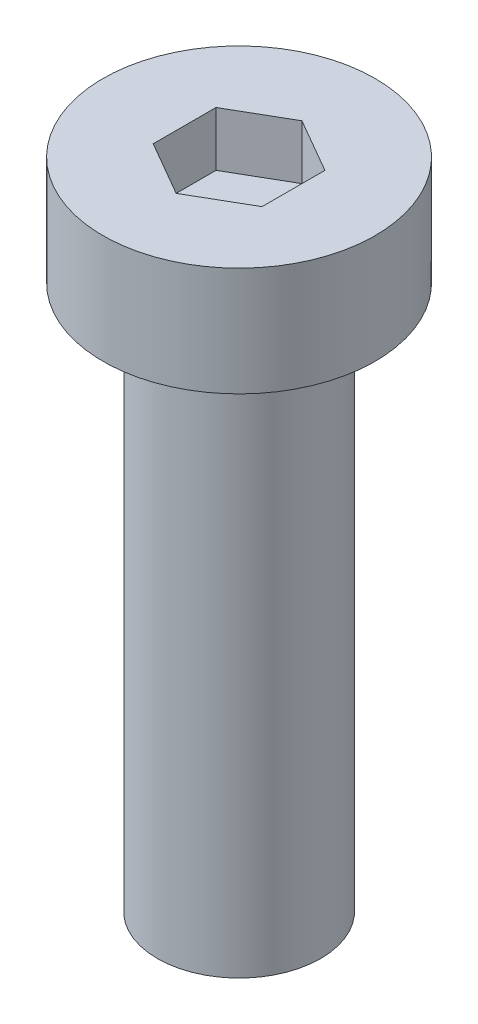
ISO-10303-21;
HEADER;
FILE_DESCRIPTION(('STEP AP214'),'2;1');
FILE_NAME('part.step','',(''),(''),'','','');
FILE_SCHEMA(('AUTOMOTIVE_DESIGN { 1 0 10303 214 1 1 1 1 }'));
ENDSEC;
DATA;
#1=APPLICATION_CONTEXT('core data for automotive mechanical design processes');
#2=APPLICATION_PROTOCOL_DEFINITION('international standard','automotive_design',2000,#1);
#3=PRODUCT_CONTEXT('',#1,'mechanical');
#4=PRODUCT('Part','Part','',(#3));
#5=PRODUCT_RELATED_PRODUCT_CATEGORY('part','',(#4));
#6=PRODUCT_DEFINITION_FORMATION('','',#4);
#7=PRODUCT_DEFINITION_CONTEXT('part definition',#1,'design');
#8=PRODUCT_DEFINITION('design','',#6,#7);
#9=PRODUCT_DEFINITION_SHAPE('','',#8);
#10=(LENGTH_UNIT() NAMED_UNIT(*) SI_UNIT(.MILLI.,.METRE.));
#11=(NAMED_UNIT(*) PLANE_ANGLE_UNIT() SI_UNIT($,.RADIAN.));
#12=(NAMED_UNIT(*) SI_UNIT($,.STERADIAN.) SOLID_ANGLE_UNIT());
#13=UNCERTAINTY_MEASURE_WITH_UNIT(LENGTH_MEASURE(1.E-05),#10,'distance_accuracy_value','');
#14=(GEOMETRIC_REPRESENTATION_CONTEXT(3) GLOBAL_UNCERTAINTY_ASSIGNED_CONTEXT((#13)) GLOBAL_UNIT_ASSIGNED_CONTEXT((#10,
#11,#12)) REPRESENTATION_CONTEXT('',''));
#15=CARTESIAN_POINT('',(0.,0.,0.));
#16=DIRECTION('',(0.,0.,1.));
#17=DIRECTION('',(1.,0.,0.));
#18=AXIS2_PLACEMENT_3D('',#15,#16,#17);
#19=CARTESIAN_POINT('',(3.,0.,0.));
#20=DIRECTION('',(0.,-1.,0.));
#21=DIRECTION('',(0.,0.,-1.));
#22=AXIS2_PLACEMENT_3D('',#19,#20,#21);
#23=PLANE('',#22);
#24=CARTESIAN_POINT('',(0.,0.,0.));
#25=DIRECTION('',(0.,-1.,0.));
#26=DIRECTION('',(0.,0.,-1.));
#27=AXIS2_PLACEMENT_3D('',#24,#25,#26);
#28=CIRCLE('',#27,3.);
#29=CARTESIAN_POINT('',(0.,0.,-3.));
#30=VERTEX_POINT('',#29);
#31=EDGE_CURVE('E134',#30,#30,#28,.T.);
#32=ORIENTED_EDGE('',*,*,#31,.T.);
#33=EDGE_LOOP('',(#32));
#34=FACE_BOUND('',#33,.T.);
#35=ADVANCED_FACE('F33',(#34),#23,.T.);
#36=CARTESIAN_POINT('',(0.,24.,0.));
#37=DIRECTION('',(0.,1.,0.));
#38=DIRECTION('',(0.,0.,1.));
#39=AXIS2_PLACEMENT_3D('',#36,#37,#38);
#40=PLANE('',#39);
#41=DIRECTION('',(0.866025403784439,0.,0.5));
#42=VECTOR('',#41,1.);
#43=CARTESIAN_POINT('',(-2.,24.,1.15470053837925));
#44=LINE('',#43,#42);
#45=CARTESIAN_POINT('',(-2.,24.,1.15470053837925));
#46=VERTEX_POINT('',#45);
#47=CARTESIAN_POINT('',(0.,24.,2.3094010767585));
#48=VERTEX_POINT('',#47);
#49=EDGE_CURVE('E47',#46,#48,#44,.T.);
#50=ORIENTED_EDGE('',*,*,#49,.F.);
#51=DIRECTION('',(0.,0.,1.));
#52=VECTOR('',#51,1.);
#53=CARTESIAN_POINT('',(-2.,24.,-1.15470053837925));
#54=LINE('',#53,#52);
#55=CARTESIAN_POINT('',(-2.,24.,-1.15470053837925));
#56=VERTEX_POINT('',#55);
#57=EDGE_CURVE('E130',#56,#46,#54,.T.);
#58=ORIENTED_EDGE('',*,*,#57,.F.);
#59=DIRECTION('',(-0.866025403784439,0.,0.5));
#60=VECTOR('',#59,1.);
#61=CARTESIAN_POINT('',(0.,24.,-2.3094010767585));
#62=LINE('',#61,#60);
#63=CARTESIAN_POINT('',(0.,24.,-2.3094010767585));
#64=VERTEX_POINT('',#63);
#65=EDGE_CURVE('E128',#64,#56,#62,.T.);
#66=ORIENTED_EDGE('',*,*,#65,.F.);
#67=DIRECTION('',(-0.866025403784439,0.,-0.5));
#68=VECTOR('',#67,1.);
#69=CARTESIAN_POINT('',(2.,24.,-1.15470053837925));
#70=LINE('',#69,#68);
#71=CARTESIAN_POINT('',(2.,24.,-1.15470053837925));
#72=VERTEX_POINT('',#71);
#73=EDGE_CURVE('E95',#72,#64,#70,.T.);
#74=ORIENTED_EDGE('',*,*,#73,.F.);
#75=DIRECTION('',(0.,0.,-1.));
#76=VECTOR('',#75,1.);
#77=CARTESIAN_POINT('',(2.,24.,1.15470053837925));
#78=LINE('',#77,#76);
#79=CARTESIAN_POINT('',(2.,24.,1.15470053837925));
#80=VERTEX_POINT('',#79);
#81=EDGE_CURVE('E124',#80,#72,#78,.T.);
#82=ORIENTED_EDGE('',*,*,#81,.F.);
#83=DIRECTION('',(0.866025403784438,0.,-0.5));
#84=VECTOR('',#83,1.);
#85=CARTESIAN_POINT('',(0.,24.,2.3094010767585));
#86=LINE('',#85,#84);
#87=EDGE_CURVE('E121',#48,#80,#86,.T.);
#88=ORIENTED_EDGE('',*,*,#87,.F.);
#89=EDGE_LOOP('',(#50,#58,#66,#74,#82,#88));
#90=FACE_BOUND('',#89,.T.);
#91=CARTESIAN_POINT('',(0.,24.,0.));
#92=DIRECTION('',(0.,-1.,0.));
#93=DIRECTION('',(0.,0.,-1.));
#94=AXIS2_PLACEMENT_3D('',#91,#92,#93);
#95=CIRCLE('',#94,5.);
#96=CARTESIAN_POINT('',(0.,24.,-5.));
#97=VERTEX_POINT('',#96);
#98=EDGE_CURVE('E11',#97,#97,#95,.T.);
#99=ORIENTED_EDGE('',*,*,#98,.F.);
#100=EDGE_LOOP('',(#99));
#101=FACE_BOUND('',#100,.T.);
#102=ADVANCED_FACE('F152',(#90,#101),#40,.T.);
#103=CARTESIAN_POINT('',(0.,0.,0.));
#104=DIRECTION('',(0.,-1.,0.));
#105=DIRECTION('',(0.,0.,-1.));
#106=AXIS2_PLACEMENT_3D('',#103,#104,#105);
#107=CYLINDRICAL_SURFACE('',#106,5.);
#108=ORIENTED_EDGE('',*,*,#98,.T.);
#109=EDGE_LOOP('',(#108));
#110=FACE_BOUND('',#109,.T.);
#111=CARTESIAN_POINT('',(0.,20.,0.));
#112=DIRECTION('',(0.,-1.,0.));
#113=DIRECTION('',(0.,0.,-1.));
#114=AXIS2_PLACEMENT_3D('',#111,#112,#113);
#115=CIRCLE('',#114,5.);
#116=CARTESIAN_POINT('',(0.,20.,-5.));
#117=VERTEX_POINT('',#116);
#118=EDGE_CURVE('E40',#117,#117,#115,.T.);
#119=ORIENTED_EDGE('',*,*,#118,.F.);
#120=EDGE_LOOP('',(#119));
#121=FACE_BOUND('',#120,.T.);
#122=ADVANCED_FACE('F150',(#110,#121),#107,.T.);
#123=CARTESIAN_POINT('',(5.,20.,0.));
#124=DIRECTION('',(0.,-1.,0.));
#125=DIRECTION('',(0.,0.,-1.));
#126=AXIS2_PLACEMENT_3D('',#123,#124,#125);
#127=PLANE('',#126);
#128=ORIENTED_EDGE('',*,*,#118,.T.);
#129=EDGE_LOOP('',(#128));
#130=FACE_BOUND('',#129,.T.);
#131=CARTESIAN_POINT('',(0.,20.,0.));
#132=DIRECTION('',(0.,-1.,0.));
#133=DIRECTION('',(0.,0.,-1.));
#134=AXIS2_PLACEMENT_3D('',#131,#132,#133);
#135=CIRCLE('',#134,3.);
#136=CARTESIAN_POINT('',(0.,20.,-3.));
#137=VERTEX_POINT('',#136);
#138=EDGE_CURVE('E142',#137,#137,#135,.T.);
#139=ORIENTED_EDGE('',*,*,#138,.F.);
#140=EDGE_LOOP('',(#139));
#141=FACE_BOUND('',#140,.T.);
#142=ADVANCED_FACE('F147',(#130,#141),#127,.T.);
#143=CARTESIAN_POINT('',(0.,0.,0.));
#144=DIRECTION('',(0.,-1.,0.));
#145=DIRECTION('',(0.,0.,-1.));
#146=AXIS2_PLACEMENT_3D('',#143,#144,#145);
#147=CYLINDRICAL_SURFACE('',#146,3.);
#148=ORIENTED_EDGE('',*,*,#138,.T.);
#149=EDGE_LOOP('',(#148));
#150=FACE_BOUND('',#149,.T.);
#151=ORIENTED_EDGE('',*,*,#31,.F.);
#152=EDGE_LOOP('',(#151));
#153=FACE_BOUND('',#152,.T.);
#154=ADVANCED_FACE('F159',(#150,#153),#147,.T.);
#155=CARTESIAN_POINT('',(-2.,22.,1.15470053837925));
#156=DIRECTION('',(-0.5,0.,0.866025403784438));
#157=DIRECTION('',(0.866025403784439,0.,0.5));
#158=AXIS2_PLACEMENT_3D('',#155,#156,#157);
#159=PLANE('',#158);
#160=ORIENTED_EDGE('',*,*,#49,.T.);
#161=DIRECTION('',(0.,1.,0.));
#162=VECTOR('',#161,1.);
#163=CARTESIAN_POINT('',(0.,22.,2.3094010767585));
#164=LINE('',#163,#162);
#165=CARTESIAN_POINT('',(0.,22.,2.3094010767585));
#166=VERTEX_POINT('',#165);
#167=EDGE_CURVE('E77',#166,#48,#164,.T.);
#168=ORIENTED_EDGE('',*,*,#167,.F.);
#169=DIRECTION('',(0.866025403784439,0.,0.5));
#170=VECTOR('',#169,1.);
#171=CARTESIAN_POINT('',(-2.,22.,1.15470053837925));
#172=LINE('',#171,#170);
#173=CARTESIAN_POINT('',(-2.,22.,1.15470053837925));
#174=VERTEX_POINT('',#173);
#175=EDGE_CURVE('E132',#174,#166,#172,.T.);
#176=ORIENTED_EDGE('',*,*,#175,.F.);
#177=DIRECTION('',(0.,1.,0.));
#178=VECTOR('',#177,1.);
#179=CARTESIAN_POINT('',(-2.,22.,1.15470053837925));
#180=LINE('',#179,#178);
#181=EDGE_CURVE('E55',#174,#46,#180,.T.);
#182=ORIENTED_EDGE('',*,*,#181,.T.);
#183=EDGE_LOOP('',(#160,#168,#176,#182));
#184=FACE_BOUND('',#183,.T.);
#185=ADVANCED_FACE('F169',(#184),#159,.F.);
#186=CARTESIAN_POINT('',(-2.,22.,-1.15470053837925));
#187=DIRECTION('',(-1.,0.,0.));
#188=DIRECTION('',(0.,0.,1.));
#189=AXIS2_PLACEMENT_3D('',#186,#187,#188);
#190=PLANE('',#189);
#191=ORIENTED_EDGE('',*,*,#57,.T.);
#192=ORIENTED_EDGE('',*,*,#181,.F.);
#193=DIRECTION('',(0.,0.,1.));
#194=VECTOR('',#193,1.);
#195=CARTESIAN_POINT('',(-2.,22.,-1.15470053837925));
#196=LINE('',#195,#194);
#197=CARTESIAN_POINT('',(-2.,22.,-1.15470053837925));
#198=VERTEX_POINT('',#197);
#199=EDGE_CURVE('E107',#198,#174,#196,.T.);
#200=ORIENTED_EDGE('',*,*,#199,.F.);
#201=DIRECTION('',(0.,1.,0.));
#202=VECTOR('',#201,1.);
#203=CARTESIAN_POINT('',(-2.,22.,-1.15470053837925));
#204=LINE('',#203,#202);
#205=EDGE_CURVE('E99',#198,#56,#204,.T.);
#206=ORIENTED_EDGE('',*,*,#205,.T.);
#207=EDGE_LOOP('',(#191,#192,#200,#206));
#208=FACE_BOUND('',#207,.T.);
#209=ADVANCED_FACE('F175',(#208),#190,.F.);
#210=CARTESIAN_POINT('',(0.,22.,-2.3094010767585));
#211=DIRECTION('',(-0.5,0.,-0.866025403784439));
#212=DIRECTION('',(-0.866025403784439,0.,0.5));
#213=AXIS2_PLACEMENT_3D('',#210,#211,#212);
#214=PLANE('',#213);
#215=ORIENTED_EDGE('',*,*,#65,.T.);
#216=ORIENTED_EDGE('',*,*,#205,.F.);
#217=DIRECTION('',(-0.866025403784439,0.,0.5));
#218=VECTOR('',#217,1.);
#219=CARTESIAN_POINT('',(0.,22.,-2.3094010767585));
#220=LINE('',#219,#218);
#221=CARTESIAN_POINT('',(0.,22.,-2.3094010767585));
#222=VERTEX_POINT('',#221);
#223=EDGE_CURVE('E103',#222,#198,#220,.T.);
#224=ORIENTED_EDGE('',*,*,#223,.F.);
#225=DIRECTION('',(0.,1.,0.));
#226=VECTOR('',#225,1.);
#227=CARTESIAN_POINT('',(0.,22.,-2.3094010767585));
#228=LINE('',#227,#226);
#229=EDGE_CURVE('E88',#222,#64,#228,.T.);
#230=ORIENTED_EDGE('',*,*,#229,.T.);
#231=EDGE_LOOP('',(#215,#216,#224,#230));
#232=FACE_BOUND('',#231,.T.);
#233=ADVANCED_FACE('F104',(#232),#214,.F.);
#234=CARTESIAN_POINT('',(2.,22.,-1.15470053837925));
#235=DIRECTION('',(0.5,0.,-0.866025403784439));
#236=DIRECTION('',(-0.866025403784439,0.,-0.5));
#237=AXIS2_PLACEMENT_3D('',#234,#235,#236);
#238=PLANE('',#237);
#239=ORIENTED_EDGE('',*,*,#73,.T.);
#240=ORIENTED_EDGE('',*,*,#229,.F.);
#241=DIRECTION('',(-0.866025403784439,0.,-0.5));
#242=VECTOR('',#241,1.);
#243=CARTESIAN_POINT('',(2.,22.,-1.15470053837925));
#244=LINE('',#243,#242);
#245=CARTESIAN_POINT('',(2.,22.,-1.15470053837925));
#246=VERTEX_POINT('',#245);
#247=EDGE_CURVE('E92',#246,#222,#244,.T.);
#248=ORIENTED_EDGE('',*,*,#247,.F.);
#249=DIRECTION('',(0.,1.,0.));
#250=VECTOR('',#249,1.);
#251=CARTESIAN_POINT('',(2.,22.,-1.15470053837925));
#252=LINE('',#251,#250);
#253=EDGE_CURVE('E100',#246,#72,#252,.T.);
#254=ORIENTED_EDGE('',*,*,#253,.T.);
#255=EDGE_LOOP('',(#239,#240,#248,#254));
#256=FACE_BOUND('',#255,.T.);
#257=ADVANCED_FACE('F90',(#256),#238,.F.);
#258=CARTESIAN_POINT('',(2.,22.,1.15470053837925));
#259=DIRECTION('',(1.,0.,0.));
#260=DIRECTION('',(0.,0.,-1.));
#261=AXIS2_PLACEMENT_3D('',#258,#259,#260);
#262=PLANE('',#261);
#263=ORIENTED_EDGE('',*,*,#81,.T.);
#264=ORIENTED_EDGE('',*,*,#253,.F.);
#265=DIRECTION('',(0.,0.,-1.));
#266=VECTOR('',#265,1.);
#267=CARTESIAN_POINT('',(2.,22.,1.15470053837925));
#268=LINE('',#267,#266);
#269=CARTESIAN_POINT('',(2.,22.,1.15470053837925));
#270=VERTEX_POINT('',#269);
#271=EDGE_CURVE('E113',#270,#246,#268,.T.);
#272=ORIENTED_EDGE('',*,*,#271,.F.);
#273=DIRECTION('',(0.,1.,0.));
#274=VECTOR('',#273,1.);
#275=CARTESIAN_POINT('',(2.,22.,1.15470053837925));
#276=LINE('',#275,#274);
#277=EDGE_CURVE('E137',#270,#80,#276,.T.);
#278=ORIENTED_EDGE('',*,*,#277,.T.);
#279=EDGE_LOOP('',(#263,#264,#272,#278));
#280=FACE_BOUND('',#279,.T.);
#281=ADVANCED_FACE('F181',(#280),#262,.F.);
#282=CARTESIAN_POINT('',(0.,22.,2.3094010767585));
#283=DIRECTION('',(0.5,0.,0.866025403784438));
#284=DIRECTION('',(0.866025403784438,0.,-0.5));
#285=AXIS2_PLACEMENT_3D('',#282,#283,#284);
#286=PLANE('',#285);
#287=ORIENTED_EDGE('',*,*,#87,.T.);
#288=ORIENTED_EDGE('',*,*,#277,.F.);
#289=DIRECTION('',(0.866025403784438,0.,-0.5));
#290=VECTOR('',#289,1.);
#291=CARTESIAN_POINT('',(0.,22.,2.3094010767585));
#292=LINE('',#291,#290);
#293=EDGE_CURVE('E115',#166,#270,#292,.T.);
#294=ORIENTED_EDGE('',*,*,#293,.F.);
#295=ORIENTED_EDGE('',*,*,#167,.T.);
#296=EDGE_LOOP('',(#287,#288,#294,#295));
#297=FACE_BOUND('',#296,.T.);
#298=ADVANCED_FACE('F178',(#297),#286,.F.);
#299=CARTESIAN_POINT('',(0.,22.,0.));
#300=DIRECTION('',(0.,1.,0.));
#301=DIRECTION('',(0.,0.,1.));
#302=AXIS2_PLACEMENT_3D('',#299,#300,#301);
#303=PLANE('',#302);
#304=ORIENTED_EDGE('',*,*,#175,.T.);
#305=ORIENTED_EDGE('',*,*,#293,.T.);
#306=ORIENTED_EDGE('',*,*,#271,.T.);
#307=ORIENTED_EDGE('',*,*,#247,.T.);
#308=ORIENTED_EDGE('',*,*,#223,.T.);
#309=ORIENTED_EDGE('',*,*,#199,.T.);
#310=EDGE_LOOP('',(#304,#305,#306,#307,#308,#309));
#311=FACE_BOUND('',#310,.T.);
#312=ADVANCED_FACE('F110',(#311),#303,.T.);
#313=CLOSED_SHELL('',(#35,#102,#122,#142,#154,#185,#209,#233,#257,#281,#298,#312));
#314=MANIFOLD_SOLID_BREP('B2',#313);
#315=ADVANCED_BREP_SHAPE_REPRESENTATION('',(#18,#314),#14);
#316=SHAPE_DEFINITION_REPRESENTATION(#9,#315);
ENDSEC;
END-ISO-10303-21;
